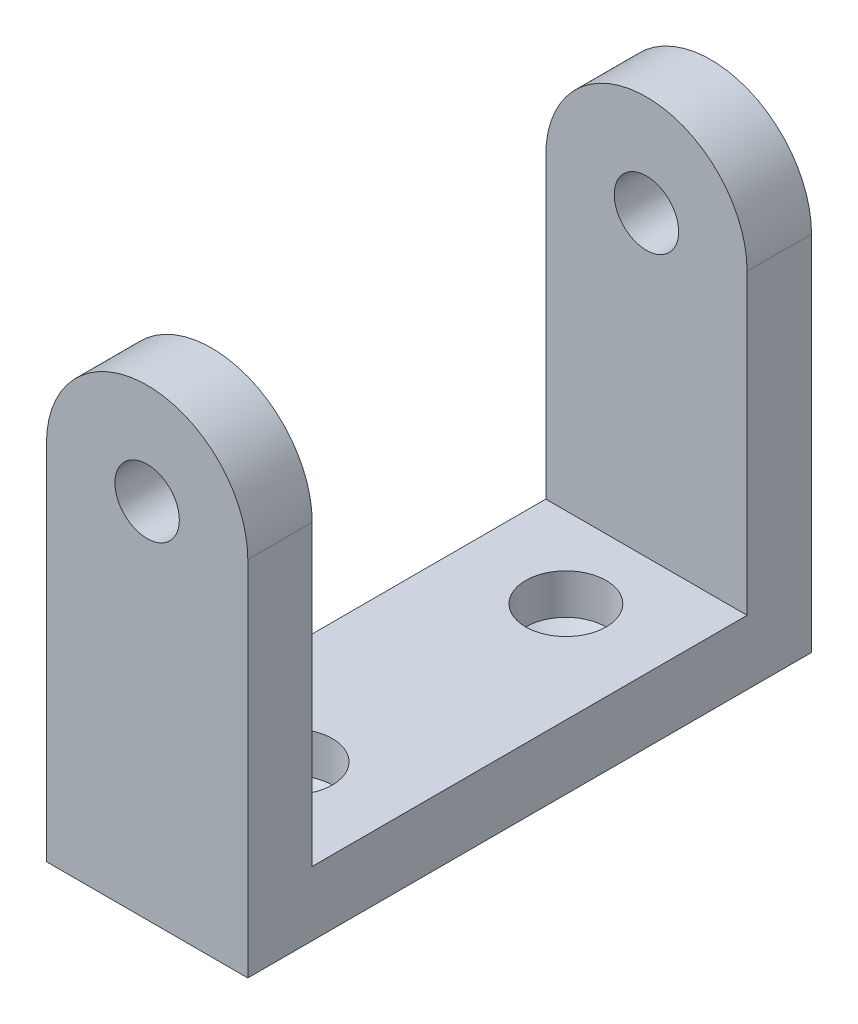
ISO-10303-21;
HEADER;
FILE_DESCRIPTION(('STEP AP214'),'2;1');
FILE_NAME('part.step','',(''),(''),'','','');
FILE_SCHEMA(('AUTOMOTIVE_DESIGN { 1 0 10303 214 1 1 1 1 }'));
ENDSEC;
DATA;
#1=APPLICATION_CONTEXT('core data for automotive mechanical design processes');
#2=APPLICATION_PROTOCOL_DEFINITION('international standard','automotive_design',2000,#1);
#3=PRODUCT_CONTEXT('',#1,'mechanical');
#4=PRODUCT('Part','Part','',(#3));
#5=PRODUCT_RELATED_PRODUCT_CATEGORY('part','',(#4));
#6=PRODUCT_DEFINITION_FORMATION('','',#4);
#7=PRODUCT_DEFINITION_CONTEXT('part definition',#1,'design');
#8=PRODUCT_DEFINITION('design','',#6,#7);
#9=PRODUCT_DEFINITION_SHAPE('','',#8);
#10=(LENGTH_UNIT() NAMED_UNIT(*) SI_UNIT(.MILLI.,.METRE.));
#11=(NAMED_UNIT(*) PLANE_ANGLE_UNIT() SI_UNIT($,.RADIAN.));
#12=(NAMED_UNIT(*) SI_UNIT($,.STERADIAN.) SOLID_ANGLE_UNIT());
#13=UNCERTAINTY_MEASURE_WITH_UNIT(LENGTH_MEASURE(1.E-05),#10,'distance_accuracy_value','');
#14=(GEOMETRIC_REPRESENTATION_CONTEXT(3) GLOBAL_UNCERTAINTY_ASSIGNED_CONTEXT((#13)) GLOBAL_UNIT_ASSIGNED_CONTEXT((#10,
#11,#12)) REPRESENTATION_CONTEXT('',''));
#15=CARTESIAN_POINT('',(0.,0.,0.));
#16=DIRECTION('',(0.,0.,1.));
#17=DIRECTION('',(1.,0.,0.));
#18=AXIS2_PLACEMENT_3D('',#15,#16,#17);
#19=CARTESIAN_POINT('',(0.,22.5,-70.));
#20=DIRECTION('',(0.,0.,1.));
#21=DIRECTION('',(1.,0.,0.));
#22=AXIS2_PLACEMENT_3D('',#19,#20,#21);
#23=CYLINDRICAL_SURFACE('',#22,12.5);
#24=CARTESIAN_POINT('',(0.,22.5,-8.));
#25=DIRECTION('',(0.,0.,1.));
#26=DIRECTION('',(0.,-1.,0.));
#27=AXIS2_PLACEMENT_3D('',#24,#25,#26);
#28=CIRCLE('',#27,12.5);
#29=CARTESIAN_POINT('',(-12.5,22.5,-8.));
#30=VERTEX_POINT('',#29);
#31=CARTESIAN_POINT('',(12.5,22.5,-8.));
#32=VERTEX_POINT('',#31);
#33=EDGE_CURVE('E59',#30,#32,#28,.F.);
#34=ORIENTED_EDGE('',*,*,#33,.F.);
#35=DIRECTION('',(0.,0.,1.));
#36=VECTOR('',#35,1.);
#37=CARTESIAN_POINT('',(-12.5,22.5,-70.));
#38=LINE('',#37,#36);
#39=CARTESIAN_POINT('',(-12.5,22.5,0.));
#40=VERTEX_POINT('',#39);
#41=EDGE_CURVE('E139',#30,#40,#38,.T.);
#42=ORIENTED_EDGE('',*,*,#41,.T.);
#43=CARTESIAN_POINT('',(0.,22.5,0.));
#44=DIRECTION('',(0.,0.,1.));
#45=DIRECTION('',(1.,0.,0.));
#46=AXIS2_PLACEMENT_3D('',#43,#44,#45);
#47=CIRCLE('',#46,12.5);
#48=CARTESIAN_POINT('',(12.5,22.5,0.));
#49=VERTEX_POINT('',#48);
#50=EDGE_CURVE('E188',#49,#40,#47,.T.);
#51=ORIENTED_EDGE('',*,*,#50,.F.);
#52=DIRECTION('',(0.,0.,1.));
#53=VECTOR('',#52,1.);
#54=CARTESIAN_POINT('',(12.5,22.5,-70.));
#55=LINE('',#54,#53);
#56=EDGE_CURVE('E184',#32,#49,#55,.T.);
#57=ORIENTED_EDGE('',*,*,#56,.F.);
#58=EDGE_LOOP('',(#34,#42,#51,#57));
#59=FACE_BOUND('',#58,.T.);
#60=ADVANCED_FACE('F43',(#59),#23,.T.);
#61=CARTESIAN_POINT('',(0.,22.5,-70.));
#62=DIRECTION('',(0.,0.,1.));
#63=DIRECTION('',(1.,0.,0.));
#64=AXIS2_PLACEMENT_3D('',#61,#62,#63);
#65=CYLINDRICAL_SURFACE('',#64,4.);
#66=CARTESIAN_POINT('',(0.,22.5,-62.));
#67=DIRECTION('',(0.,0.,-1.));
#68=DIRECTION('',(0.,1.,0.));
#69=AXIS2_PLACEMENT_3D('',#66,#67,#68);
#70=CIRCLE('',#69,4.);
#71=CARTESIAN_POINT('',(0.,26.5,-62.));
#72=VERTEX_POINT('',#71);
#73=EDGE_CURVE('E144',#72,#72,#70,.F.);
#74=ORIENTED_EDGE('',*,*,#73,.T.);
#75=EDGE_LOOP('',(#74));
#76=FACE_BOUND('',#75,.T.);
#77=CARTESIAN_POINT('',(0.,22.5,-70.));
#78=DIRECTION('',(0.,0.,1.));
#79=DIRECTION('',(1.,0.,0.));
#80=AXIS2_PLACEMENT_3D('',#77,#78,#79);
#81=CIRCLE('',#80,4.);
#82=CARTESIAN_POINT('',(4.,22.5,-70.));
#83=VERTEX_POINT('',#82);
#84=EDGE_CURVE('E162',#83,#83,#81,.T.);
#85=ORIENTED_EDGE('',*,*,#84,.F.);
#86=EDGE_LOOP('',(#85));
#87=FACE_BOUND('',#86,.T.);
#88=ADVANCED_FACE('F216',(#76,#87),#65,.F.);
#89=CARTESIAN_POINT('',(12.5,22.5,-70.));
#90=DIRECTION('',(1.,0.,0.));
#91=DIRECTION('',(0.,1.,0.));
#92=AXIS2_PLACEMENT_3D('',#89,#90,#91);
#93=PLANE('',#92);
#94=DIRECTION('',(0.,1.,0.));
#95=VECTOR('',#94,1.);
#96=CARTESIAN_POINT('',(12.5,22.5,-62.));
#97=LINE('',#96,#95);
#98=CARTESIAN_POINT('',(12.5,-14.5,-62.));
#99=VERTEX_POINT('',#98);
#100=CARTESIAN_POINT('',(12.5,22.5,-62.));
#101=VERTEX_POINT('',#100);
#102=EDGE_CURVE('E155',#99,#101,#97,.T.);
#103=ORIENTED_EDGE('',*,*,#102,.F.);
#104=DIRECTION('',(0.,0.,-1.));
#105=VECTOR('',#104,1.);
#106=CARTESIAN_POINT('',(12.5,-14.5,-70.));
#107=LINE('',#106,#105);
#108=CARTESIAN_POINT('',(12.5,-14.5,-8.00000000000001));
#109=VERTEX_POINT('',#108);
#110=EDGE_CURVE('E158',#109,#99,#107,.T.);
#111=ORIENTED_EDGE('',*,*,#110,.F.);
#112=DIRECTION('',(0.,-1.,0.));
#113=VECTOR('',#112,1.);
#114=CARTESIAN_POINT('',(12.5,22.5,-8.));
#115=LINE('',#114,#113);
#116=EDGE_CURVE('E133',#32,#109,#115,.T.);
#117=ORIENTED_EDGE('',*,*,#116,.F.);
#118=ORIENTED_EDGE('',*,*,#56,.T.);
#119=DIRECTION('',(0.,1.,0.));
#120=VECTOR('',#119,1.);
#121=CARTESIAN_POINT('',(12.5,22.5,0.));
#122=LINE('',#121,#120);
#123=CARTESIAN_POINT('',(12.5,-22.5,0.));
#124=VERTEX_POINT('',#123);
#125=EDGE_CURVE('E166',#124,#49,#122,.T.);
#126=ORIENTED_EDGE('',*,*,#125,.F.);
#127=DIRECTION('',(0.,0.,1.));
#128=VECTOR('',#127,1.);
#129=CARTESIAN_POINT('',(12.5,-22.5,-70.));
#130=LINE('',#129,#128);
#131=CARTESIAN_POINT('',(12.5,-22.5,-70.));
#132=VERTEX_POINT('',#131);
#133=EDGE_CURVE('E52',#132,#124,#130,.T.);
#134=ORIENTED_EDGE('',*,*,#133,.F.);
#135=DIRECTION('',(0.,1.,0.));
#136=VECTOR('',#135,1.);
#137=CARTESIAN_POINT('',(12.5,22.5,-70.));
#138=LINE('',#137,#136);
#139=CARTESIAN_POINT('',(12.5,22.5,-70.));
#140=VERTEX_POINT('',#139);
#141=EDGE_CURVE('E170',#132,#140,#138,.T.);
#142=ORIENTED_EDGE('',*,*,#141,.T.);
#143=EDGE_CURVE('E93',#140,#101,#55,.T.);
#144=ORIENTED_EDGE('',*,*,#143,.T.);
#145=EDGE_LOOP('',(#103,#111,#117,#118,#126,#134,#142,#144));
#146=FACE_BOUND('',#145,.T.);
#147=ADVANCED_FACE('F45',(#146),#93,.T.);
#148=CARTESIAN_POINT('',(-12.5,-22.5,-70.));
#149=DIRECTION('',(0.,-1.,0.));
#150=DIRECTION('',(0.,0.,-1.));
#151=AXIS2_PLACEMENT_3D('',#148,#149,#150);
#152=PLANE('',#151);
#153=CARTESIAN_POINT('',(0.,-22.5,-52.));
#154=DIRECTION('',(0.,-1.,0.));
#155=DIRECTION('',(0.,0.,-1.));
#156=AXIS2_PLACEMENT_3D('',#153,#154,#155);
#157=CIRCLE('',#156,3.);
#158=CARTESIAN_POINT('',(0.,-22.5,-55.));
#159=VERTEX_POINT('',#158);
#160=EDGE_CURVE('E273',#159,#159,#157,.T.);
#161=ORIENTED_EDGE('',*,*,#160,.F.);
#162=EDGE_LOOP('',(#161));
#163=FACE_BOUND('',#162,.T.);
#164=CARTESIAN_POINT('',(0.,-22.5,-18.));
#165=DIRECTION('',(0.,-1.,0.));
#166=DIRECTION('',(0.,0.,-1.));
#167=AXIS2_PLACEMENT_3D('',#164,#165,#166);
#168=CIRCLE('',#167,3.);
#169=CARTESIAN_POINT('',(0.,-22.5,-21.));
#170=VERTEX_POINT('',#169);
#171=EDGE_CURVE('E135',#170,#170,#168,.T.);
#172=ORIENTED_EDGE('',*,*,#171,.F.);
#173=EDGE_LOOP('',(#172));
#174=FACE_BOUND('',#173,.T.);
#175=DIRECTION('',(1.,0.,0.));
#176=VECTOR('',#175,1.);
#177=CARTESIAN_POINT('',(-12.5,-22.5,0.));
#178=LINE('',#177,#176);
#179=CARTESIAN_POINT('',(-12.5,-22.5,0.));
#180=VERTEX_POINT('',#179);
#181=EDGE_CURVE('E174',#180,#124,#178,.T.);
#182=ORIENTED_EDGE('',*,*,#181,.F.);
#183=DIRECTION('',(0.,0.,1.));
#184=VECTOR('',#183,1.);
#185=CARTESIAN_POINT('',(-12.5,-22.5,-70.));
#186=LINE('',#185,#184);
#187=CARTESIAN_POINT('',(-12.5,-22.5,-70.));
#188=VERTEX_POINT('',#187);
#189=EDGE_CURVE('E201',#188,#180,#186,.T.);
#190=ORIENTED_EDGE('',*,*,#189,.F.);
#191=DIRECTION('',(1.,0.,0.));
#192=VECTOR('',#191,1.);
#193=CARTESIAN_POINT('',(-12.5,-22.5,-70.));
#194=LINE('',#193,#192);
#195=EDGE_CURVE('E181',#188,#132,#194,.T.);
#196=ORIENTED_EDGE('',*,*,#195,.T.);
#197=ORIENTED_EDGE('',*,*,#133,.T.);
#198=EDGE_LOOP('',(#182,#190,#196,#197));
#199=FACE_BOUND('',#198,.T.);
#200=ADVANCED_FACE('F246',(#163,#174,#199),#152,.T.);
#201=CARTESIAN_POINT('',(-12.5,22.5,-70.));
#202=DIRECTION('',(-1.,0.,0.));
#203=DIRECTION('',(0.,-1.,0.));
#204=AXIS2_PLACEMENT_3D('',#201,#202,#203);
#205=PLANE('',#204);
#206=DIRECTION('',(0.,-1.,0.));
#207=VECTOR('',#206,1.);
#208=CARTESIAN_POINT('',(-12.5,22.5,-62.));
#209=LINE('',#208,#207);
#210=CARTESIAN_POINT('',(-12.5,22.5,-62.));
#211=VERTEX_POINT('',#210);
#212=CARTESIAN_POINT('',(-12.5,-14.5,-62.));
#213=VERTEX_POINT('',#212);
#214=EDGE_CURVE('E152',#211,#213,#209,.T.);
#215=ORIENTED_EDGE('',*,*,#214,.F.);
#216=CARTESIAN_POINT('',(-12.5,22.5,-70.));
#217=VERTEX_POINT('',#216);
#218=EDGE_CURVE('E204',#217,#211,#38,.T.);
#219=ORIENTED_EDGE('',*,*,#218,.F.);
#220=DIRECTION('',(0.,-1.,0.));
#221=VECTOR('',#220,1.);
#222=CARTESIAN_POINT('',(-12.5,22.5,-70.));
#223=LINE('',#222,#221);
#224=EDGE_CURVE('E177',#217,#188,#223,.T.);
#225=ORIENTED_EDGE('',*,*,#224,.T.);
#226=ORIENTED_EDGE('',*,*,#189,.T.);
#227=DIRECTION('',(0.,-1.,0.));
#228=VECTOR('',#227,1.);
#229=CARTESIAN_POINT('',(-12.5,22.5,0.));
#230=LINE('',#229,#228);
#231=EDGE_CURVE('E192',#40,#180,#230,.T.);
#232=ORIENTED_EDGE('',*,*,#231,.F.);
#233=ORIENTED_EDGE('',*,*,#41,.F.);
#234=DIRECTION('',(0.,1.,0.));
#235=VECTOR('',#234,1.);
#236=CARTESIAN_POINT('',(-12.5,22.5,-8.));
#237=LINE('',#236,#235);
#238=CARTESIAN_POINT('',(-12.5,-14.5,-8.00000000000001));
#239=VERTEX_POINT('',#238);
#240=EDGE_CURVE('E130',#239,#30,#237,.T.);
#241=ORIENTED_EDGE('',*,*,#240,.F.);
#242=DIRECTION('',(0.,0.,1.));
#243=VECTOR('',#242,1.);
#244=CARTESIAN_POINT('',(-12.5,-14.5,-70.));
#245=LINE('',#244,#243);
#246=EDGE_CURVE('E11',#213,#239,#245,.T.);
#247=ORIENTED_EDGE('',*,*,#246,.F.);
#248=EDGE_LOOP('',(#215,#219,#225,#226,#232,#233,#241,#247));
#249=FACE_BOUND('',#248,.T.);
#250=ADVANCED_FACE('F137',(#249),#205,.T.);
#251=ORIENTED_EDGE('',*,*,#218,.T.);
#252=CARTESIAN_POINT('',(0.,22.5,-62.));
#253=DIRECTION('',(0.,0.,-1.));
#254=DIRECTION('',(0.,1.,0.));
#255=AXIS2_PLACEMENT_3D('',#252,#253,#254);
#256=CIRCLE('',#255,12.5);
#257=EDGE_CURVE('E149',#101,#211,#256,.F.);
#258=ORIENTED_EDGE('',*,*,#257,.F.);
#259=ORIENTED_EDGE('',*,*,#143,.F.);
#260=CARTESIAN_POINT('',(0.,22.5,-70.));
#261=DIRECTION('',(0.,0.,1.));
#262=DIRECTION('',(1.,0.,0.));
#263=AXIS2_PLACEMENT_3D('',#260,#261,#262);
#264=CIRCLE('',#263,12.5);
#265=EDGE_CURVE('E173',#140,#217,#264,.T.);
#266=ORIENTED_EDGE('',*,*,#265,.T.);
#267=EDGE_LOOP('',(#251,#258,#259,#266));
#268=FACE_BOUND('',#267,.T.);
#269=ADVANCED_FACE('F233',(#268),#23,.T.);
#270=CARTESIAN_POINT('',(0.,22.5,-70.));
#271=DIRECTION('',(0.,0.,1.));
#272=DIRECTION('',(1.,0.,0.));
#273=AXIS2_PLACEMENT_3D('',#270,#271,#272);
#274=PLANE('',#273);
#275=ORIENTED_EDGE('',*,*,#84,.T.);
#276=EDGE_LOOP('',(#275));
#277=FACE_BOUND('',#276,.T.);
#278=ORIENTED_EDGE('',*,*,#141,.F.);
#279=ORIENTED_EDGE('',*,*,#195,.F.);
#280=ORIENTED_EDGE('',*,*,#224,.F.);
#281=ORIENTED_EDGE('',*,*,#265,.F.);
#282=EDGE_LOOP('',(#278,#279,#280,#281));
#283=FACE_BOUND('',#282,.T.);
#284=ADVANCED_FACE('F239',(#277,#283),#274,.F.);
#285=CARTESIAN_POINT('',(0.,22.5,0.));
#286=DIRECTION('',(0.,0.,1.));
#287=DIRECTION('',(1.,0.,0.));
#288=AXIS2_PLACEMENT_3D('',#285,#286,#287);
#289=PLANE('',#288);
#290=CARTESIAN_POINT('',(0.,22.5,0.));
#291=DIRECTION('',(0.,0.,1.));
#292=DIRECTION('',(1.,0.,0.));
#293=AXIS2_PLACEMENT_3D('',#290,#291,#292);
#294=CIRCLE('',#293,4.);
#295=CARTESIAN_POINT('',(4.,22.5,0.));
#296=VERTEX_POINT('',#295);
#297=EDGE_CURVE('E161',#296,#296,#294,.T.);
#298=ORIENTED_EDGE('',*,*,#297,.F.);
#299=EDGE_LOOP('',(#298));
#300=FACE_BOUND('',#299,.T.);
#301=ORIENTED_EDGE('',*,*,#125,.T.);
#302=ORIENTED_EDGE('',*,*,#50,.T.);
#303=ORIENTED_EDGE('',*,*,#231,.T.);
#304=ORIENTED_EDGE('',*,*,#181,.T.);
#305=EDGE_LOOP('',(#301,#302,#303,#304));
#306=FACE_BOUND('',#305,.T.);
#307=ADVANCED_FACE('F229',(#300,#306),#289,.T.);
#308=CARTESIAN_POINT('',(0.,22.5,-8.));
#309=DIRECTION('',(0.,0.,1.));
#310=DIRECTION('',(0.,-1.,0.));
#311=AXIS2_PLACEMENT_3D('',#308,#309,#310);
#312=CIRCLE('',#311,4.);
#313=CARTESIAN_POINT('',(0.,18.5,-8.));
#314=VERTEX_POINT('',#313);
#315=EDGE_CURVE('E146',#314,#314,#312,.F.);
#316=ORIENTED_EDGE('',*,*,#315,.T.);
#317=EDGE_LOOP('',(#316));
#318=FACE_BOUND('',#317,.T.);
#319=ORIENTED_EDGE('',*,*,#297,.T.);
#320=EDGE_LOOP('',(#319));
#321=FACE_BOUND('',#320,.T.);
#322=ADVANCED_FACE('F221',(#318,#321),#65,.F.);
#323=CARTESIAN_POINT('',(-22.5,35.,-62.));
#324=DIRECTION('',(0.,0.,-1.));
#325=DIRECTION('',(0.,1.,0.));
#326=AXIS2_PLACEMENT_3D('',#323,#324,#325);
#327=PLANE('',#326);
#328=ORIENTED_EDGE('',*,*,#102,.T.);
#329=ORIENTED_EDGE('',*,*,#257,.T.);
#330=ORIENTED_EDGE('',*,*,#214,.T.);
#331=DIRECTION('',(1.,0.,0.));
#332=VECTOR('',#331,1.);
#333=CARTESIAN_POINT('',(-22.5,-14.5,-62.));
#334=LINE('',#333,#332);
#335=EDGE_CURVE('E123',#213,#99,#334,.T.);
#336=ORIENTED_EDGE('',*,*,#335,.T.);
#337=EDGE_LOOP('',(#328,#329,#330,#336));
#338=FACE_BOUND('',#337,.T.);
#339=ORIENTED_EDGE('',*,*,#73,.F.);
#340=EDGE_LOOP('',(#339));
#341=FACE_BOUND('',#340,.T.);
#342=ADVANCED_FACE('F219',(#338,#341),#327,.F.);
#343=CARTESIAN_POINT('',(-22.5,35.,-8.));
#344=DIRECTION('',(0.,0.,1.));
#345=DIRECTION('',(0.,-1.,0.));
#346=AXIS2_PLACEMENT_3D('',#343,#344,#345);
#347=PLANE('',#346);
#348=ORIENTED_EDGE('',*,*,#116,.T.);
#349=DIRECTION('',(1.,0.,0.));
#350=VECTOR('',#349,1.);
#351=CARTESIAN_POINT('',(-22.5,-14.5,-8.00000000000001));
#352=LINE('',#351,#350);
#353=EDGE_CURVE('E120',#239,#109,#352,.T.);
#354=ORIENTED_EDGE('',*,*,#353,.F.);
#355=ORIENTED_EDGE('',*,*,#240,.T.);
#356=ORIENTED_EDGE('',*,*,#33,.T.);
#357=EDGE_LOOP('',(#348,#354,#355,#356));
#358=FACE_BOUND('',#357,.T.);
#359=ORIENTED_EDGE('',*,*,#315,.F.);
#360=EDGE_LOOP('',(#359));
#361=FACE_BOUND('',#360,.T.);
#362=ADVANCED_FACE('F128',(#358,#361),#347,.F.);
#363=CARTESIAN_POINT('',(-22.5,-14.5,-8.00000000000001));
#364=DIRECTION('',(0.,-1.,0.));
#365=DIRECTION('',(1.,0.,0.));
#366=AXIS2_PLACEMENT_3D('',#363,#364,#365);
#367=PLANE('',#366);
#368=CARTESIAN_POINT('',(0.,-14.5,-52.));
#369=DIRECTION('',(0.,1.,0.));
#370=DIRECTION('',(0.,0.,1.));
#371=AXIS2_PLACEMENT_3D('',#368,#369,#370);
#372=CIRCLE('',#371,5.);
#373=CARTESIAN_POINT('',(0.,-14.5,-47.));
#374=VERTEX_POINT('',#373);
#375=EDGE_CURVE('E285',#374,#374,#372,.T.);
#376=ORIENTED_EDGE('',*,*,#375,.F.);
#377=EDGE_LOOP('',(#376));
#378=FACE_BOUND('',#377,.T.);
#379=CARTESIAN_POINT('',(0.,-14.5,-18.));
#380=DIRECTION('',(0.,1.,0.));
#381=DIRECTION('',(0.,0.,1.));
#382=AXIS2_PLACEMENT_3D('',#379,#380,#381);
#383=CIRCLE('',#382,5.);
#384=CARTESIAN_POINT('',(0.,-14.5,-13.));
#385=VERTEX_POINT('',#384);
#386=EDGE_CURVE('E269',#385,#385,#383,.T.);
#387=ORIENTED_EDGE('',*,*,#386,.F.);
#388=EDGE_LOOP('',(#387));
#389=FACE_BOUND('',#388,.T.);
#390=ORIENTED_EDGE('',*,*,#110,.T.);
#391=ORIENTED_EDGE('',*,*,#335,.F.);
#392=ORIENTED_EDGE('',*,*,#246,.T.);
#393=ORIENTED_EDGE('',*,*,#353,.T.);
#394=EDGE_LOOP('',(#390,#391,#392,#393));
#395=FACE_BOUND('',#394,.T.);
#396=ADVANCED_FACE('F119',(#378,#389,#395),#367,.F.);
#397=CARTESIAN_POINT('',(0.,-14.5,-18.));
#398=DIRECTION('',(0.,1.,0.));
#399=DIRECTION('',(0.,0.,1.));
#400=AXIS2_PLACEMENT_3D('',#397,#398,#399);
#401=CYLINDRICAL_SURFACE('',#400,3.);
#402=CARTESIAN_POINT('',(0.,-20.7017212380551,-18.));
#403=DIRECTION('',(0.,1.,0.));
#404=DIRECTION('',(0.,0.,1.));
#405=AXIS2_PLACEMENT_3D('',#402,#403,#404);
#406=CIRCLE('',#405,3.);
#407=CARTESIAN_POINT('',(0.,-20.7017212380551,-15.));
#408=VERTEX_POINT('',#407);
#409=EDGE_CURVE('E261',#408,#408,#406,.T.);
#410=ORIENTED_EDGE('',*,*,#409,.T.);
#411=EDGE_LOOP('',(#410));
#412=FACE_BOUND('',#411,.T.);
#413=ORIENTED_EDGE('',*,*,#171,.T.);
#414=EDGE_LOOP('',(#413));
#415=FACE_BOUND('',#414,.T.);
#416=ADVANCED_FACE('F294',(#412,#415),#401,.F.);
#417=CARTESIAN_POINT('',(0.,-19.5,-18.));
#418=DIRECTION('',(0.,1.,0.));
#419=DIRECTION('',(0.,0.,1.));
#420=AXIS2_PLACEMENT_3D('',#417,#418,#419);
#421=CONICAL_SURFACE('',#420,5.,1.02974425867666);
#422=ORIENTED_EDGE('',*,*,#409,.F.);
#423=EDGE_LOOP('',(#422));
#424=FACE_BOUND('',#423,.T.);
#425=CARTESIAN_POINT('',(0.,-19.5,-18.));
#426=DIRECTION('',(0.,1.,0.));
#427=DIRECTION('',(0.,0.,1.));
#428=AXIS2_PLACEMENT_3D('',#425,#426,#427);
#429=CIRCLE('',#428,5.);
#430=CARTESIAN_POINT('',(0.,-19.5,-13.));
#431=VERTEX_POINT('',#430);
#432=EDGE_CURVE('E265',#431,#431,#429,.T.);
#433=ORIENTED_EDGE('',*,*,#432,.T.);
#434=EDGE_LOOP('',(#433));
#435=FACE_BOUND('',#434,.T.);
#436=ADVANCED_FACE('F301',(#424,#435),#421,.F.);
#437=CARTESIAN_POINT('',(0.,-14.5,-18.));
#438=DIRECTION('',(0.,1.,0.));
#439=DIRECTION('',(0.,0.,1.));
#440=AXIS2_PLACEMENT_3D('',#437,#438,#439);
#441=CYLINDRICAL_SURFACE('',#440,5.);
#442=ORIENTED_EDGE('',*,*,#432,.F.);
#443=EDGE_LOOP('',(#442));
#444=FACE_BOUND('',#443,.T.);
#445=ORIENTED_EDGE('',*,*,#386,.T.);
#446=EDGE_LOOP('',(#445));
#447=FACE_BOUND('',#446,.T.);
#448=ADVANCED_FACE('F298',(#444,#447),#441,.F.);
#449=CARTESIAN_POINT('',(0.,-14.5,-52.));
#450=DIRECTION('',(0.,1.,0.));
#451=DIRECTION('',(0.,0.,1.));
#452=AXIS2_PLACEMENT_3D('',#449,#450,#451);
#453=CYLINDRICAL_SURFACE('',#452,3.);
#454=CARTESIAN_POINT('',(0.,-20.7017212380551,-52.));
#455=DIRECTION('',(0.,1.,0.));
#456=DIRECTION('',(0.,0.,1.));
#457=AXIS2_PLACEMENT_3D('',#454,#455,#456);
#458=CIRCLE('',#457,3.);
#459=CARTESIAN_POINT('',(0.,-20.7017212380551,-49.));
#460=VERTEX_POINT('',#459);
#461=EDGE_CURVE('E277',#460,#460,#458,.T.);
#462=ORIENTED_EDGE('',*,*,#461,.T.);
#463=EDGE_LOOP('',(#462));
#464=FACE_BOUND('',#463,.T.);
#465=ORIENTED_EDGE('',*,*,#160,.T.);
#466=EDGE_LOOP('',(#465));
#467=FACE_BOUND('',#466,.T.);
#468=ADVANCED_FACE('F300',(#464,#467),#453,.F.);
#469=CARTESIAN_POINT('',(0.,-19.5,-52.));
#470=DIRECTION('',(0.,1.,0.));
#471=DIRECTION('',(0.,0.,1.));
#472=AXIS2_PLACEMENT_3D('',#469,#470,#471);
#473=CONICAL_SURFACE('',#472,5.,1.02974425867666);
#474=ORIENTED_EDGE('',*,*,#461,.F.);
#475=EDGE_LOOP('',(#474));
#476=FACE_BOUND('',#475,.T.);
#477=CARTESIAN_POINT('',(0.,-19.5,-52.));
#478=DIRECTION('',(0.,1.,0.));
#479=DIRECTION('',(0.,0.,1.));
#480=AXIS2_PLACEMENT_3D('',#477,#478,#479);
#481=CIRCLE('',#480,5.);
#482=CARTESIAN_POINT('',(0.,-19.5,-47.));
#483=VERTEX_POINT('',#482);
#484=EDGE_CURVE('E281',#483,#483,#481,.T.);
#485=ORIENTED_EDGE('',*,*,#484,.T.);
#486=EDGE_LOOP('',(#485));
#487=FACE_BOUND('',#486,.T.);
#488=ADVANCED_FACE('F308',(#476,#487),#473,.F.);
#489=CARTESIAN_POINT('',(0.,-14.5,-52.));
#490=DIRECTION('',(0.,1.,0.));
#491=DIRECTION('',(0.,0.,1.));
#492=AXIS2_PLACEMENT_3D('',#489,#490,#491);
#493=CYLINDRICAL_SURFACE('',#492,5.);
#494=ORIENTED_EDGE('',*,*,#484,.F.);
#495=EDGE_LOOP('',(#494));
#496=FACE_BOUND('',#495,.T.);
#497=ORIENTED_EDGE('',*,*,#375,.T.);
#498=EDGE_LOOP('',(#497));
#499=FACE_BOUND('',#498,.T.);
#500=ADVANCED_FACE('F290',(#496,#499),#493,.F.);
#501=CLOSED_SHELL('',(#60,#88,#147,#200,#250,#269,#284,#307,#322,#342,#362,#396,#416,#436,#448,
#468,#488,#500));
#502=MANIFOLD_SOLID_BREP('B2',#501);
#503=ADVANCED_BREP_SHAPE_REPRESENTATION('',(#18,#502),#14);
#504=SHAPE_DEFINITION_REPRESENTATION(#9,#503);
ENDSEC;
END-ISO-10303-21;
